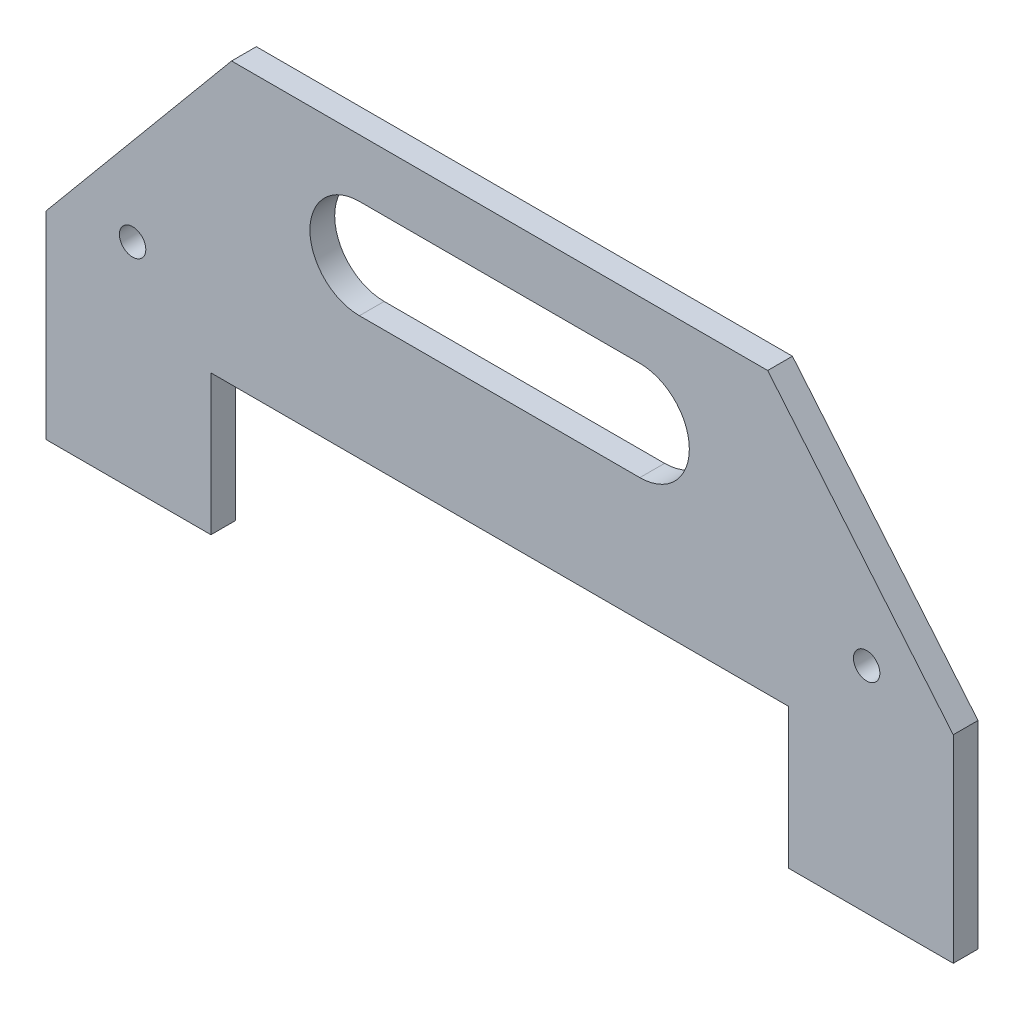
ISO-10303-21;
HEADER;
FILE_DESCRIPTION(('STEP AP214'),'2;1');
FILE_NAME('part.step','',(''),(''),'','','');
FILE_SCHEMA(('AUTOMOTIVE_DESIGN { 1 0 10303 214 1 1 1 1 }'));
ENDSEC;
DATA;
#1=APPLICATION_CONTEXT('core data for automotive mechanical design processes');
#2=APPLICATION_PROTOCOL_DEFINITION('international standard','automotive_design',2000,#1);
#3=PRODUCT_CONTEXT('',#1,'mechanical');
#4=PRODUCT('Part','Part','',(#3));
#5=PRODUCT_RELATED_PRODUCT_CATEGORY('part','',(#4));
#6=PRODUCT_DEFINITION_FORMATION('','',#4);
#7=PRODUCT_DEFINITION_CONTEXT('part definition',#1,'design');
#8=PRODUCT_DEFINITION('design','',#6,#7);
#9=PRODUCT_DEFINITION_SHAPE('','',#8);
#10=(LENGTH_UNIT() NAMED_UNIT(*) SI_UNIT(.MILLI.,.METRE.));
#11=(NAMED_UNIT(*) PLANE_ANGLE_UNIT() SI_UNIT($,.RADIAN.));
#12=(NAMED_UNIT(*) SI_UNIT($,.STERADIAN.) SOLID_ANGLE_UNIT());
#13=UNCERTAINTY_MEASURE_WITH_UNIT(LENGTH_MEASURE(1.E-05),#10,'distance_accuracy_value','');
#14=(GEOMETRIC_REPRESENTATION_CONTEXT(3) GLOBAL_UNCERTAINTY_ASSIGNED_CONTEXT((#13)) GLOBAL_UNIT_ASSIGNED_CONTEXT((#10,
#11,#12)) REPRESENTATION_CONTEXT('',''));
#15=CARTESIAN_POINT('',(0.,0.,0.));
#16=DIRECTION('',(0.,0.,1.));
#17=DIRECTION('',(1.,0.,0.));
#18=AXIS2_PLACEMENT_3D('',#15,#16,#17);
#19=CARTESIAN_POINT('',(-55.,0.,3.));
#20=DIRECTION('',(0.,1.,0.));
#21=DIRECTION('',(0.,0.,1.));
#22=AXIS2_PLACEMENT_3D('',#19,#20,#21);
#23=PLANE('',#22);
#24=DIRECTION('',(1.,0.,0.));
#25=VECTOR('',#24,1.);
#26=CARTESIAN_POINT('',(-55.,0.,0.));
#27=LINE('',#26,#25);
#28=CARTESIAN_POINT('',(-55.,0.,0.));
#29=VERTEX_POINT('',#28);
#30=CARTESIAN_POINT('',(-35.,0.,0.));
#31=VERTEX_POINT('',#30);
#32=EDGE_CURVE('E226',#29,#31,#27,.T.);
#33=ORIENTED_EDGE('',*,*,#32,.T.);
#34=DIRECTION('',(0.,0.,1.));
#35=VECTOR('',#34,1.);
#36=CARTESIAN_POINT('',(-35.,0.,-0.00100000000000143));
#37=LINE('',#36,#35);
#38=CARTESIAN_POINT('',(-35.,0.,3.));
#39=VERTEX_POINT('',#38);
#40=EDGE_CURVE('E184',#31,#39,#37,.T.);
#41=ORIENTED_EDGE('',*,*,#40,.T.);
#42=DIRECTION('',(1.,0.,0.));
#43=VECTOR('',#42,1.);
#44=CARTESIAN_POINT('',(-55.,0.,3.));
#45=LINE('',#44,#43);
#46=CARTESIAN_POINT('',(-55.,0.,3.));
#47=VERTEX_POINT('',#46);
#48=EDGE_CURVE('E211',#47,#39,#45,.T.);
#49=ORIENTED_EDGE('',*,*,#48,.F.);
#50=DIRECTION('',(0.,0.,-1.));
#51=VECTOR('',#50,1.);
#52=CARTESIAN_POINT('',(-55.,0.,3.));
#53=LINE('',#52,#51);
#54=EDGE_CURVE('E11',#47,#29,#53,.T.);
#55=ORIENTED_EDGE('',*,*,#54,.T.);
#56=EDGE_LOOP('',(#33,#41,#49,#55));
#57=FACE_BOUND('',#56,.T.);
#58=ADVANCED_FACE('F32',(#57),#23,.F.);
#59=CARTESIAN_POINT('',(-55.,24.,3.));
#60=DIRECTION('',(1.,0.,0.));
#61=DIRECTION('',(0.,1.,0.));
#62=AXIS2_PLACEMENT_3D('',#59,#60,#61);
#63=PLANE('',#62);
#64=DIRECTION('',(0.,-1.,0.));
#65=VECTOR('',#64,1.);
#66=CARTESIAN_POINT('',(-55.,24.,0.));
#67=LINE('',#66,#65);
#68=CARTESIAN_POINT('',(-55.,24.,0.));
#69=VERTEX_POINT('',#68);
#70=EDGE_CURVE('E205',#69,#29,#67,.T.);
#71=ORIENTED_EDGE('',*,*,#70,.T.);
#72=ORIENTED_EDGE('',*,*,#54,.F.);
#73=DIRECTION('',(0.,-1.,0.));
#74=VECTOR('',#73,1.);
#75=CARTESIAN_POINT('',(-55.,24.,3.));
#76=LINE('',#75,#74);
#77=CARTESIAN_POINT('',(-55.,24.,3.));
#78=VERTEX_POINT('',#77);
#79=EDGE_CURVE('E206',#78,#47,#76,.T.);
#80=ORIENTED_EDGE('',*,*,#79,.F.);
#81=DIRECTION('',(0.,0.,-1.));
#82=VECTOR('',#81,1.);
#83=CARTESIAN_POINT('',(-55.,24.,3.));
#84=LINE('',#83,#82);
#85=EDGE_CURVE('E222',#78,#69,#84,.T.);
#86=ORIENTED_EDGE('',*,*,#85,.T.);
#87=EDGE_LOOP('',(#71,#72,#80,#86));
#88=FACE_BOUND('',#87,.T.);
#89=ADVANCED_FACE('F34',(#88),#63,.F.);
#90=CARTESIAN_POINT('',(35.,0.,3.));
#91=VERTEX_POINT('',#90);
#92=CARTESIAN_POINT('',(55.,0.,3.));
#93=VERTEX_POINT('',#92);
#94=EDGE_CURVE('E209',#91,#93,#45,.T.);
#95=ORIENTED_EDGE('',*,*,#94,.F.);
#96=DIRECTION('',(0.,0.,1.));
#97=VECTOR('',#96,1.);
#98=CARTESIAN_POINT('',(35.,0.,-0.00100000000000143));
#99=LINE('',#98,#97);
#100=CARTESIAN_POINT('',(35.,0.,0.));
#101=VERTEX_POINT('',#100);
#102=EDGE_CURVE('E190',#101,#91,#99,.T.);
#103=ORIENTED_EDGE('',*,*,#102,.F.);
#104=CARTESIAN_POINT('',(55.,0.,0.));
#105=VERTEX_POINT('',#104);
#106=EDGE_CURVE('E225',#101,#105,#27,.T.);
#107=ORIENTED_EDGE('',*,*,#106,.T.);
#108=DIRECTION('',(0.,0.,-1.));
#109=VECTOR('',#108,1.);
#110=CARTESIAN_POINT('',(55.,0.,3.));
#111=LINE('',#110,#109);
#112=EDGE_CURVE('E40',#93,#105,#111,.T.);
#113=ORIENTED_EDGE('',*,*,#112,.F.);
#114=EDGE_LOOP('',(#95,#103,#107,#113));
#115=FACE_BOUND('',#114,.T.);
#116=ADVANCED_FACE('F279',(#115),#23,.F.);
#117=CARTESIAN_POINT('',(55.,0.,3.));
#118=DIRECTION('',(-1.,0.,0.));
#119=DIRECTION('',(0.,-1.,0.));
#120=AXIS2_PLACEMENT_3D('',#117,#118,#119);
#121=PLANE('',#120);
#122=DIRECTION('',(0.,1.,0.));
#123=VECTOR('',#122,1.);
#124=CARTESIAN_POINT('',(55.,0.,0.));
#125=LINE('',#124,#123);
#126=CARTESIAN_POINT('',(55.,24.,0.));
#127=VERTEX_POINT('',#126);
#128=EDGE_CURVE('E229',#105,#127,#125,.T.);
#129=ORIENTED_EDGE('',*,*,#128,.T.);
#130=DIRECTION('',(0.,0.,-1.));
#131=VECTOR('',#130,1.);
#132=CARTESIAN_POINT('',(55.,24.,3.));
#133=LINE('',#132,#131);
#134=CARTESIAN_POINT('',(55.,24.,3.));
#135=VERTEX_POINT('',#134);
#136=EDGE_CURVE('E244',#135,#127,#133,.T.);
#137=ORIENTED_EDGE('',*,*,#136,.F.);
#138=DIRECTION('',(0.,1.,0.));
#139=VECTOR('',#138,1.);
#140=CARTESIAN_POINT('',(55.,0.,3.));
#141=LINE('',#140,#139);
#142=EDGE_CURVE('E214',#93,#135,#141,.T.);
#143=ORIENTED_EDGE('',*,*,#142,.F.);
#144=ORIENTED_EDGE('',*,*,#112,.T.);
#145=EDGE_LOOP('',(#129,#137,#143,#144));
#146=FACE_BOUND('',#145,.T.);
#147=ADVANCED_FACE('F251',(#146),#121,.F.);
#148=CARTESIAN_POINT('',(55.,24.,3.));
#149=DIRECTION('',(-0.768221279597376,-0.64018439966448,0.));
#150=DIRECTION('',(0.64018439966448,-0.768221279597376,0.));
#151=AXIS2_PLACEMENT_3D('',#148,#149,#150);
#152=PLANE('',#151);
#153=DIRECTION('',(-0.64018439966448,0.768221279597376,0.));
#154=VECTOR('',#153,1.);
#155=CARTESIAN_POINT('',(55.,24.,0.));
#156=LINE('',#155,#154);
#157=CARTESIAN_POINT('',(32.5,51.,0.));
#158=VERTEX_POINT('',#157);
#159=EDGE_CURVE('E231',#127,#158,#156,.T.);
#160=ORIENTED_EDGE('',*,*,#159,.T.);
#161=DIRECTION('',(0.,0.,-1.));
#162=VECTOR('',#161,1.);
#163=CARTESIAN_POINT('',(32.5,51.,3.));
#164=LINE('',#163,#162);
#165=CARTESIAN_POINT('',(32.5,51.,3.));
#166=VERTEX_POINT('',#165);
#167=EDGE_CURVE('E241',#166,#158,#164,.T.);
#168=ORIENTED_EDGE('',*,*,#167,.F.);
#169=DIRECTION('',(-0.64018439966448,0.768221279597376,0.));
#170=VECTOR('',#169,1.);
#171=CARTESIAN_POINT('',(55.,24.,3.));
#172=LINE('',#171,#170);
#173=EDGE_CURVE('E216',#135,#166,#172,.T.);
#174=ORIENTED_EDGE('',*,*,#173,.F.);
#175=ORIENTED_EDGE('',*,*,#136,.T.);
#176=EDGE_LOOP('',(#160,#168,#174,#175));
#177=FACE_BOUND('',#176,.T.);
#178=ADVANCED_FACE('F264',(#177),#152,.F.);
#179=CARTESIAN_POINT('',(32.5,51.,3.));
#180=DIRECTION('',(0.,-1.,0.));
#181=DIRECTION('',(0.,0.,-1.));
#182=AXIS2_PLACEMENT_3D('',#179,#180,#181);
#183=PLANE('',#182);
#184=DIRECTION('',(-1.,0.,0.));
#185=VECTOR('',#184,1.);
#186=CARTESIAN_POINT('',(32.5,51.,0.));
#187=LINE('',#186,#185);
#188=CARTESIAN_POINT('',(-32.5,51.,0.));
#189=VERTEX_POINT('',#188);
#190=EDGE_CURVE('E233',#158,#189,#187,.T.);
#191=ORIENTED_EDGE('',*,*,#190,.T.);
#192=DIRECTION('',(0.,0.,-1.));
#193=VECTOR('',#192,1.);
#194=CARTESIAN_POINT('',(-32.5,51.,3.));
#195=LINE('',#194,#193);
#196=CARTESIAN_POINT('',(-32.5,51.,3.));
#197=VERTEX_POINT('',#196);
#198=EDGE_CURVE('E238',#197,#189,#195,.T.);
#199=ORIENTED_EDGE('',*,*,#198,.F.);
#200=DIRECTION('',(-1.,0.,0.));
#201=VECTOR('',#200,1.);
#202=CARTESIAN_POINT('',(32.5,51.,3.));
#203=LINE('',#202,#201);
#204=EDGE_CURVE('E218',#166,#197,#203,.T.);
#205=ORIENTED_EDGE('',*,*,#204,.F.);
#206=ORIENTED_EDGE('',*,*,#167,.T.);
#207=EDGE_LOOP('',(#191,#199,#205,#206));
#208=FACE_BOUND('',#207,.T.);
#209=ADVANCED_FACE('F268',(#208),#183,.F.);
#210=CARTESIAN_POINT('',(-32.5,51.,3.));
#211=DIRECTION('',(0.768221279597376,-0.64018439966448,0.));
#212=DIRECTION('',(0.64018439966448,0.768221279597376,0.));
#213=AXIS2_PLACEMENT_3D('',#210,#211,#212);
#214=PLANE('',#213);
#215=DIRECTION('',(-0.64018439966448,-0.768221279597376,0.));
#216=VECTOR('',#215,1.);
#217=CARTESIAN_POINT('',(-32.5,51.,0.));
#218=LINE('',#217,#216);
#219=EDGE_CURVE('E210',#189,#69,#218,.T.);
#220=ORIENTED_EDGE('',*,*,#219,.T.);
#221=ORIENTED_EDGE('',*,*,#85,.F.);
#222=DIRECTION('',(-0.64018439966448,-0.768221279597376,0.));
#223=VECTOR('',#222,1.);
#224=CARTESIAN_POINT('',(-32.5,51.,3.));
#225=LINE('',#224,#223);
#226=EDGE_CURVE('E220',#197,#78,#225,.T.);
#227=ORIENTED_EDGE('',*,*,#226,.F.);
#228=ORIENTED_EDGE('',*,*,#198,.T.);
#229=EDGE_LOOP('',(#220,#221,#227,#228));
#230=FACE_BOUND('',#229,.T.);
#231=ADVANCED_FACE('F294',(#230),#214,.F.);
#232=CARTESIAN_POINT('',(0.,0.,3.));
#233=DIRECTION('',(0.,0.,1.));
#234=DIRECTION('',(1.,0.,0.));
#235=AXIS2_PLACEMENT_3D('',#232,#233,#234);
#236=PLANE('',#235);
#237=CARTESIAN_POINT('',(-17.,38.,3.));
#238=DIRECTION('',(0.,0.,1.));
#239=DIRECTION('',(1.,0.,0.));
#240=AXIS2_PLACEMENT_3D('',#237,#238,#239);
#241=CIRCLE('',#240,6.);
#242=CARTESIAN_POINT('',(-17.,44.,3.));
#243=VERTEX_POINT('',#242);
#244=CARTESIAN_POINT('',(-17.,32.,3.));
#245=VERTEX_POINT('',#244);
#246=EDGE_CURVE('E47',#243,#245,#241,.T.);
#247=ORIENTED_EDGE('',*,*,#246,.F.);
#248=DIRECTION('',(-1.,0.,0.));
#249=VECTOR('',#248,1.);
#250=CARTESIAN_POINT('',(-17.,44.,3.));
#251=LINE('',#250,#249);
#252=CARTESIAN_POINT('',(17.,44.,3.));
#253=VERTEX_POINT('',#252);
#254=EDGE_CURVE('E141',#253,#243,#251,.T.);
#255=ORIENTED_EDGE('',*,*,#254,.F.);
#256=CARTESIAN_POINT('',(17.,38.,3.));
#257=DIRECTION('',(0.,0.,1.));
#258=DIRECTION('',(1.,0.,0.));
#259=AXIS2_PLACEMENT_3D('',#256,#257,#258);
#260=CIRCLE('',#259,5.99999999999998);
#261=CARTESIAN_POINT('',(17.,32.,3.));
#262=VERTEX_POINT('',#261);
#263=EDGE_CURVE('E161',#262,#253,#260,.T.);
#264=ORIENTED_EDGE('',*,*,#263,.F.);
#265=DIRECTION('',(1.,0.,0.));
#266=VECTOR('',#265,1.);
#267=CARTESIAN_POINT('',(-17.,32.,3.));
#268=LINE('',#267,#266);
#269=EDGE_CURVE('E155',#245,#262,#268,.T.);
#270=ORIENTED_EDGE('',*,*,#269,.F.);
#271=EDGE_LOOP('',(#247,#255,#264,#270));
#272=FACE_BOUND('',#271,.T.);
#273=DIRECTION('',(0.,-1.,0.));
#274=VECTOR('',#273,1.);
#275=CARTESIAN_POINT('',(-35.,17.,3.));
#276=LINE('',#275,#274);
#277=CARTESIAN_POINT('',(-35.,17.,3.));
#278=VERTEX_POINT('',#277);
#279=EDGE_CURVE('E176',#278,#39,#276,.T.);
#280=ORIENTED_EDGE('',*,*,#279,.F.);
#281=DIRECTION('',(-1.,0.,0.));
#282=VECTOR('',#281,1.);
#283=CARTESIAN_POINT('',(-35.,17.,3.));
#284=LINE('',#283,#282);
#285=CARTESIAN_POINT('',(35.,17.,3.));
#286=VERTEX_POINT('',#285);
#287=EDGE_CURVE('E181',#286,#278,#284,.T.);
#288=ORIENTED_EDGE('',*,*,#287,.F.);
#289=DIRECTION('',(0.,1.,0.));
#290=VECTOR('',#289,1.);
#291=CARTESIAN_POINT('',(35.,17.,3.));
#292=LINE('',#291,#290);
#293=EDGE_CURVE('E178',#91,#286,#292,.T.);
#294=ORIENTED_EDGE('',*,*,#293,.F.);
#295=ORIENTED_EDGE('',*,*,#94,.T.);
#296=ORIENTED_EDGE('',*,*,#142,.T.);
#297=ORIENTED_EDGE('',*,*,#173,.T.);
#298=ORIENTED_EDGE('',*,*,#204,.T.);
#299=ORIENTED_EDGE('',*,*,#226,.T.);
#300=ORIENTED_EDGE('',*,*,#79,.T.);
#301=ORIENTED_EDGE('',*,*,#48,.T.);
#302=EDGE_LOOP('',(#280,#288,#294,#295,#296,#297,#298,#299,#300,#301));
#303=FACE_BOUND('',#302,.T.);
#304=CARTESIAN_POINT('',(44.5,26.,3.));
#305=DIRECTION('',(0.,0.,1.));
#306=DIRECTION('',(1.,0.,0.));
#307=AXIS2_PLACEMENT_3D('',#304,#305,#306);
#308=CIRCLE('',#307,1.59999999999999);
#309=CARTESIAN_POINT('',(46.1,26.,3.));
#310=VERTEX_POINT('',#309);
#311=EDGE_CURVE('E196',#310,#310,#308,.T.);
#312=ORIENTED_EDGE('',*,*,#311,.F.);
#313=EDGE_LOOP('',(#312));
#314=FACE_BOUND('',#313,.T.);
#315=CARTESIAN_POINT('',(-44.5,26.,3.));
#316=DIRECTION('',(0.,0.,1.));
#317=DIRECTION('',(1.,0.,0.));
#318=AXIS2_PLACEMENT_3D('',#315,#316,#317);
#319=CIRCLE('',#318,1.59999999999999);
#320=CARTESIAN_POINT('',(-42.9,26.,3.));
#321=VERTEX_POINT('',#320);
#322=EDGE_CURVE('E202',#321,#321,#319,.T.);
#323=ORIENTED_EDGE('',*,*,#322,.F.);
#324=EDGE_LOOP('',(#323));
#325=FACE_BOUND('',#324,.T.);
#326=ADVANCED_FACE('F273',(#272,#303,#314,#325),#236,.T.);
#327=CARTESIAN_POINT('',(0.,0.,0.));
#328=DIRECTION('',(0.,0.,1.));
#329=DIRECTION('',(1.,0.,0.));
#330=AXIS2_PLACEMENT_3D('',#327,#328,#329);
#331=PLANE('',#330);
#332=DIRECTION('',(1.,0.,0.));
#333=VECTOR('',#332,1.);
#334=CARTESIAN_POINT('',(-17.,44.,0.));
#335=LINE('',#334,#333);
#336=CARTESIAN_POINT('',(-17.,44.,0.));
#337=VERTEX_POINT('',#336);
#338=CARTESIAN_POINT('',(17.,44.,0.));
#339=VERTEX_POINT('',#338);
#340=EDGE_CURVE('E153',#337,#339,#335,.T.);
#341=ORIENTED_EDGE('',*,*,#340,.F.);
#342=CARTESIAN_POINT('',(-17.,38.,0.));
#343=DIRECTION('',(0.,0.,1.));
#344=DIRECTION('',(1.,0.,0.));
#345=AXIS2_PLACEMENT_3D('',#342,#343,#344);
#346=CIRCLE('',#345,6.);
#347=CARTESIAN_POINT('',(-17.,32.,0.));
#348=VERTEX_POINT('',#347);
#349=EDGE_CURVE('E135',#348,#337,#346,.F.);
#350=ORIENTED_EDGE('',*,*,#349,.F.);
#351=DIRECTION('',(-1.,0.,0.));
#352=VECTOR('',#351,1.);
#353=CARTESIAN_POINT('',(-17.,32.,0.));
#354=LINE('',#353,#352);
#355=CARTESIAN_POINT('',(17.,32.,0.));
#356=VERTEX_POINT('',#355);
#357=EDGE_CURVE('E144',#356,#348,#354,.T.);
#358=ORIENTED_EDGE('',*,*,#357,.F.);
#359=CARTESIAN_POINT('',(17.,38.,0.));
#360=DIRECTION('',(0.,0.,1.));
#361=DIRECTION('',(1.,0.,0.));
#362=AXIS2_PLACEMENT_3D('',#359,#360,#361);
#363=CIRCLE('',#362,5.99999999999998);
#364=EDGE_CURVE('E55',#339,#356,#363,.F.);
#365=ORIENTED_EDGE('',*,*,#364,.F.);
#366=EDGE_LOOP('',(#341,#350,#358,#365));
#367=FACE_BOUND('',#366,.T.);
#368=CARTESIAN_POINT('',(44.5,26.,0.));
#369=DIRECTION('',(0.,0.,-1.));
#370=DIRECTION('',(-1.,0.,0.));
#371=AXIS2_PLACEMENT_3D('',#368,#369,#370);
#372=CIRCLE('',#371,1.59999999999999);
#373=CARTESIAN_POINT('',(42.9,26.,0.));
#374=VERTEX_POINT('',#373);
#375=EDGE_CURVE('E187',#374,#374,#372,.T.);
#376=ORIENTED_EDGE('',*,*,#375,.F.);
#377=EDGE_LOOP('',(#376));
#378=FACE_BOUND('',#377,.T.);
#379=CARTESIAN_POINT('',(-44.5,26.,0.));
#380=DIRECTION('',(0.,0.,-1.));
#381=DIRECTION('',(-1.,0.,0.));
#382=AXIS2_PLACEMENT_3D('',#379,#380,#381);
#383=CIRCLE('',#382,1.59999999999999);
#384=CARTESIAN_POINT('',(-46.1,26.,0.));
#385=VERTEX_POINT('',#384);
#386=EDGE_CURVE('E199',#385,#385,#383,.T.);
#387=ORIENTED_EDGE('',*,*,#386,.F.);
#388=EDGE_LOOP('',(#387));
#389=FACE_BOUND('',#388,.T.);
#390=DIRECTION('',(1.,0.,0.));
#391=VECTOR('',#390,1.);
#392=CARTESIAN_POINT('',(-35.,17.,0.));
#393=LINE('',#392,#391);
#394=CARTESIAN_POINT('',(-35.,17.,0.));
#395=VERTEX_POINT('',#394);
#396=CARTESIAN_POINT('',(35.,17.,0.));
#397=VERTEX_POINT('',#396);
#398=EDGE_CURVE('E171',#395,#397,#393,.T.);
#399=ORIENTED_EDGE('',*,*,#398,.F.);
#400=DIRECTION('',(0.,1.,0.));
#401=VECTOR('',#400,1.);
#402=CARTESIAN_POINT('',(-35.,17.,0.));
#403=LINE('',#402,#401);
#404=EDGE_CURVE('E173',#31,#395,#403,.T.);
#405=ORIENTED_EDGE('',*,*,#404,.F.);
#406=ORIENTED_EDGE('',*,*,#32,.F.);
#407=ORIENTED_EDGE('',*,*,#70,.F.);
#408=ORIENTED_EDGE('',*,*,#219,.F.);
#409=ORIENTED_EDGE('',*,*,#190,.F.);
#410=ORIENTED_EDGE('',*,*,#159,.F.);
#411=ORIENTED_EDGE('',*,*,#128,.F.);
#412=ORIENTED_EDGE('',*,*,#106,.F.);
#413=DIRECTION('',(0.,-1.,0.));
#414=VECTOR('',#413,1.);
#415=CARTESIAN_POINT('',(35.,17.,0.));
#416=LINE('',#415,#414);
#417=EDGE_CURVE('E147',#397,#101,#416,.T.);
#418=ORIENTED_EDGE('',*,*,#417,.F.);
#419=EDGE_LOOP('',(#399,#405,#406,#407,#408,#409,#410,#411,#412,#418));
#420=FACE_BOUND('',#419,.T.);
#421=ADVANCED_FACE('F150',(#367,#378,#389,#420),#331,.F.);
#422=CARTESIAN_POINT('',(-44.5,26.,0.));
#423=DIRECTION('',(0.,0.,-1.));
#424=DIRECTION('',(-1.,0.,0.));
#425=AXIS2_PLACEMENT_3D('',#422,#423,#424);
#426=CYLINDRICAL_SURFACE('',#425,1.59999999999999);
#427=ORIENTED_EDGE('',*,*,#322,.T.);
#428=EDGE_LOOP('',(#427));
#429=FACE_BOUND('',#428,.T.);
#430=ORIENTED_EDGE('',*,*,#386,.T.);
#431=EDGE_LOOP('',(#430));
#432=FACE_BOUND('',#431,.T.);
#433=ADVANCED_FACE('F334',(#429,#432),#426,.F.);
#434=CARTESIAN_POINT('',(44.5,26.,0.));
#435=DIRECTION('',(0.,0.,-1.));
#436=DIRECTION('',(-1.,0.,0.));
#437=AXIS2_PLACEMENT_3D('',#434,#435,#436);
#438=CYLINDRICAL_SURFACE('',#437,1.59999999999999);
#439=ORIENTED_EDGE('',*,*,#311,.T.);
#440=EDGE_LOOP('',(#439));
#441=FACE_BOUND('',#440,.T.);
#442=ORIENTED_EDGE('',*,*,#375,.T.);
#443=EDGE_LOOP('',(#442));
#444=FACE_BOUND('',#443,.T.);
#445=ADVANCED_FACE('F339',(#441,#444),#438,.F.);
#446=CARTESIAN_POINT('',(-35.,17.,-0.00100000000000143));
#447=DIRECTION('',(-1.,0.,0.));
#448=DIRECTION('',(0.,0.,1.));
#449=AXIS2_PLACEMENT_3D('',#446,#447,#448);
#450=PLANE('',#449);
#451=ORIENTED_EDGE('',*,*,#404,.T.);
#452=DIRECTION('',(0.,0.,1.));
#453=VECTOR('',#452,1.);
#454=CARTESIAN_POINT('',(-35.,17.,-0.00100000000000143));
#455=LINE('',#454,#453);
#456=EDGE_CURVE('E185',#395,#278,#455,.T.);
#457=ORIENTED_EDGE('',*,*,#456,.T.);
#458=ORIENTED_EDGE('',*,*,#279,.T.);
#459=ORIENTED_EDGE('',*,*,#40,.F.);
#460=EDGE_LOOP('',(#451,#457,#458,#459));
#461=FACE_BOUND('',#460,.T.);
#462=ADVANCED_FACE('F287',(#461),#450,.F.);
#463=CARTESIAN_POINT('',(-35.,17.,-0.00100000000000143));
#464=DIRECTION('',(0.,1.,0.));
#465=DIRECTION('',(0.,0.,1.));
#466=AXIS2_PLACEMENT_3D('',#463,#464,#465);
#467=PLANE('',#466);
#468=ORIENTED_EDGE('',*,*,#398,.T.);
#469=DIRECTION('',(0.,0.,1.));
#470=VECTOR('',#469,1.);
#471=CARTESIAN_POINT('',(35.,17.,-0.00100000000000143));
#472=LINE('',#471,#470);
#473=EDGE_CURVE('E188',#397,#286,#472,.T.);
#474=ORIENTED_EDGE('',*,*,#473,.T.);
#475=ORIENTED_EDGE('',*,*,#287,.T.);
#476=ORIENTED_EDGE('',*,*,#456,.F.);
#477=EDGE_LOOP('',(#468,#474,#475,#476));
#478=FACE_BOUND('',#477,.T.);
#479=ADVANCED_FACE('F285',(#478),#467,.F.);
#480=CARTESIAN_POINT('',(35.,17.,-0.00100000000000143));
#481=DIRECTION('',(1.,0.,0.));
#482=DIRECTION('',(0.,1.,0.));
#483=AXIS2_PLACEMENT_3D('',#480,#481,#482);
#484=PLANE('',#483);
#485=ORIENTED_EDGE('',*,*,#417,.T.);
#486=ORIENTED_EDGE('',*,*,#102,.T.);
#487=ORIENTED_EDGE('',*,*,#293,.T.);
#488=ORIENTED_EDGE('',*,*,#473,.F.);
#489=EDGE_LOOP('',(#485,#486,#487,#488));
#490=FACE_BOUND('',#489,.T.);
#491=ADVANCED_FACE('F281',(#490),#484,.F.);
#492=CARTESIAN_POINT('',(-17.,38.,-0.00100000000000143));
#493=DIRECTION('',(0.,0.,1.));
#494=DIRECTION('',(1.,0.,0.));
#495=AXIS2_PLACEMENT_3D('',#492,#493,#494);
#496=CYLINDRICAL_SURFACE('',#495,6.);
#497=ORIENTED_EDGE('',*,*,#349,.T.);
#498=DIRECTION('',(0.,0.,1.));
#499=VECTOR('',#498,1.);
#500=CARTESIAN_POINT('',(-17.,44.,-0.00100000000000143));
#501=LINE('',#500,#499);
#502=EDGE_CURVE('E148',#337,#243,#501,.T.);
#503=ORIENTED_EDGE('',*,*,#502,.T.);
#504=ORIENTED_EDGE('',*,*,#246,.T.);
#505=DIRECTION('',(0.,0.,1.));
#506=VECTOR('',#505,1.);
#507=CARTESIAN_POINT('',(-17.,32.,-0.00100000000000143));
#508=LINE('',#507,#506);
#509=EDGE_CURVE('E131',#348,#245,#508,.T.);
#510=ORIENTED_EDGE('',*,*,#509,.F.);
#511=EDGE_LOOP('',(#497,#503,#504,#510));
#512=FACE_BOUND('',#511,.T.);
#513=ADVANCED_FACE('F133',(#512),#496,.F.);
#514=CARTESIAN_POINT('',(-17.,44.,-0.00100000000000143));
#515=DIRECTION('',(0.,1.,0.));
#516=DIRECTION('',(-1.,0.,0.));
#517=AXIS2_PLACEMENT_3D('',#514,#515,#516);
#518=PLANE('',#517);
#519=ORIENTED_EDGE('',*,*,#340,.T.);
#520=DIRECTION('',(0.,0.,1.));
#521=VECTOR('',#520,1.);
#522=CARTESIAN_POINT('',(17.,44.,-0.00100000000000143));
#523=LINE('',#522,#521);
#524=EDGE_CURVE('E167',#339,#253,#523,.T.);
#525=ORIENTED_EDGE('',*,*,#524,.T.);
#526=ORIENTED_EDGE('',*,*,#254,.T.);
#527=ORIENTED_EDGE('',*,*,#502,.F.);
#528=EDGE_LOOP('',(#519,#525,#526,#527));
#529=FACE_BOUND('',#528,.T.);
#530=ADVANCED_FACE('F404',(#529),#518,.F.);
#531=CARTESIAN_POINT('',(17.,38.,-0.00100000000000143));
#532=DIRECTION('',(0.,0.,1.));
#533=DIRECTION('',(1.,0.,0.));
#534=AXIS2_PLACEMENT_3D('',#531,#532,#533);
#535=CYLINDRICAL_SURFACE('',#534,5.99999999999998);
#536=ORIENTED_EDGE('',*,*,#364,.T.);
#537=DIRECTION('',(0.,0.,1.));
#538=VECTOR('',#537,1.);
#539=CARTESIAN_POINT('',(17.,32.,-0.00100000000000143));
#540=LINE('',#539,#538);
#541=EDGE_CURVE('E140',#356,#262,#540,.T.);
#542=ORIENTED_EDGE('',*,*,#541,.T.);
#543=ORIENTED_EDGE('',*,*,#263,.T.);
#544=ORIENTED_EDGE('',*,*,#524,.F.);
#545=EDGE_LOOP('',(#536,#542,#543,#544));
#546=FACE_BOUND('',#545,.T.);
#547=ADVANCED_FACE('F413',(#546),#535,.F.);
#548=CARTESIAN_POINT('',(-17.,32.,-0.00100000000000143));
#549=DIRECTION('',(0.,-1.,0.));
#550=DIRECTION('',(1.,0.,0.));
#551=AXIS2_PLACEMENT_3D('',#548,#549,#550);
#552=PLANE('',#551);
#553=ORIENTED_EDGE('',*,*,#357,.T.);
#554=ORIENTED_EDGE('',*,*,#509,.T.);
#555=ORIENTED_EDGE('',*,*,#269,.T.);
#556=ORIENTED_EDGE('',*,*,#541,.F.);
#557=EDGE_LOOP('',(#553,#554,#555,#556));
#558=FACE_BOUND('',#557,.T.);
#559=ADVANCED_FACE('F145',(#558),#552,.F.);
#560=CLOSED_SHELL('',(#58,#89,#116,#147,#178,#209,#231,#326,#421,#433,#445,#462,#479,#491,#513,
#530,#547,#559));
#561=MANIFOLD_SOLID_BREP('B2',#560);
#562=ADVANCED_BREP_SHAPE_REPRESENTATION('',(#18,#561),#14);
#563=SHAPE_DEFINITION_REPRESENTATION(#9,#562);
ENDSEC;
END-ISO-10303-21;
